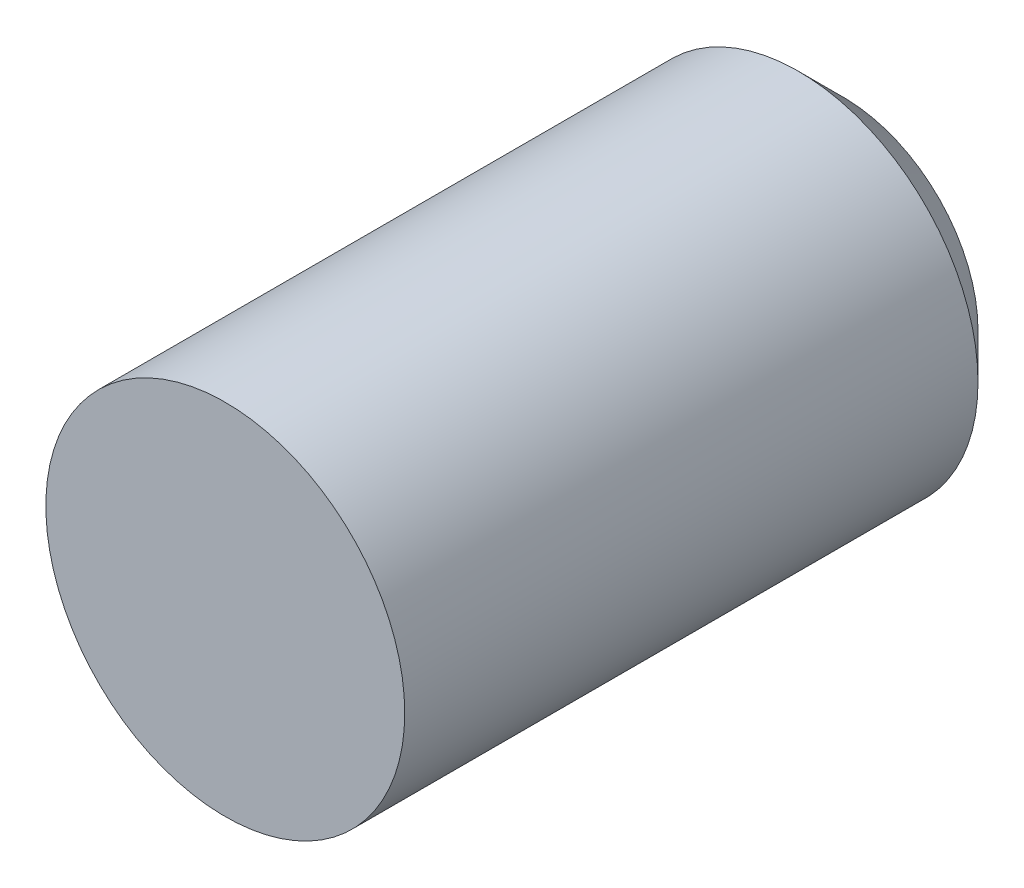
ISO-10303-21;
HEADER;
FILE_DESCRIPTION(('STEP AP214'),'2;1');
FILE_NAME('part.step','',(''),(''),'','','');
FILE_SCHEMA(('AUTOMOTIVE_DESIGN { 1 0 10303 214 1 1 1 1 }'));
ENDSEC;
DATA;
#1=APPLICATION_CONTEXT('core data for automotive mechanical design processes');
#2=APPLICATION_PROTOCOL_DEFINITION('international standard','automotive_design',2000,#1);
#3=PRODUCT_CONTEXT('',#1,'mechanical');
#4=PRODUCT('Part','Part','',(#3));
#5=PRODUCT_RELATED_PRODUCT_CATEGORY('part','',(#4));
#6=PRODUCT_DEFINITION_FORMATION('','',#4);
#7=PRODUCT_DEFINITION_CONTEXT('part definition',#1,'design');
#8=PRODUCT_DEFINITION('design','',#6,#7);
#9=PRODUCT_DEFINITION_SHAPE('','',#8);
#10=(LENGTH_UNIT() NAMED_UNIT(*) SI_UNIT(.MILLI.,.METRE.));
#11=(NAMED_UNIT(*) PLANE_ANGLE_UNIT() SI_UNIT($,.RADIAN.));
#12=(NAMED_UNIT(*) SI_UNIT($,.STERADIAN.) SOLID_ANGLE_UNIT());
#13=UNCERTAINTY_MEASURE_WITH_UNIT(LENGTH_MEASURE(1.E-05),#10,'distance_accuracy_value','');
#14=(GEOMETRIC_REPRESENTATION_CONTEXT(3) GLOBAL_UNCERTAINTY_ASSIGNED_CONTEXT((#13)) GLOBAL_UNIT_ASSIGNED_CONTEXT((#10,
#11,#12)) REPRESENTATION_CONTEXT('',''));
#15=CARTESIAN_POINT('',(0.,0.,0.));
#16=DIRECTION('',(0.,0.,1.));
#17=DIRECTION('',(1.,0.,0.));
#18=AXIS2_PLACEMENT_3D('',#15,#16,#17);
#19=CARTESIAN_POINT('',(0.,0.,0.));
#20=DIRECTION('',(0.,0.,1.));
#21=DIRECTION('',(1.,0.,0.));
#22=AXIS2_PLACEMENT_3D('',#19,#20,#21);
#23=PLANE('',#22);
#24=CARTESIAN_POINT('',(0.,0.,0.));
#25=DIRECTION('',(0.,0.,1.));
#26=DIRECTION('',(1.,0.,0.));
#27=AXIS2_PLACEMENT_3D('',#24,#25,#26);
#28=CIRCLE('',#27,1.0125);
#29=CARTESIAN_POINT('',(1.0125,0.,0.));
#30=VERTEX_POINT('',#29);
#31=EDGE_CURVE('E27',#30,#30,#28,.T.);
#32=ORIENTED_EDGE('',*,*,#31,.F.);
#33=EDGE_LOOP('',(#32));
#34=FACE_BOUND('',#33,.T.);
#35=ADVANCED_FACE('F16',(#34),#23,.F.);
#36=CARTESIAN_POINT('',(0.,0.,4.65));
#37=DIRECTION('',(0.,0.,1.));
#38=DIRECTION('',(1.,0.,0.));
#39=AXIS2_PLACEMENT_3D('',#36,#37,#38);
#40=PLANE('',#39);
#41=CARTESIAN_POINT('',(0.,0.,4.65));
#42=DIRECTION('',(0.,0.,1.));
#43=DIRECTION('',(1.,0.,0.));
#44=AXIS2_PLACEMENT_3D('',#41,#42,#43);
#45=CIRCLE('',#44,1.35);
#46=CARTESIAN_POINT('',(1.35,0.,4.65));
#47=VERTEX_POINT('',#46);
#48=EDGE_CURVE('E20',#47,#47,#45,.T.);
#49=ORIENTED_EDGE('',*,*,#48,.T.);
#50=EDGE_LOOP('',(#49));
#51=FACE_BOUND('',#50,.T.);
#52=ADVANCED_FACE('F76',(#51),#40,.T.);
#53=CARTESIAN_POINT('',(0.,0.,0.3375));
#54=DIRECTION('',(0.,0.,1.));
#55=DIRECTION('',(1.,0.,0.));
#56=AXIS2_PLACEMENT_3D('',#53,#54,#55);
#57=CONICAL_SURFACE('',#56,1.35,0.785398163397);
#58=ORIENTED_EDGE('',*,*,#31,.T.);
#59=DIRECTION('',(-0.707106781186548,0.,-0.707106781186548));
#60=VECTOR('',#59,1.);
#61=CARTESIAN_POINT('',(1.35,0.,0.3375));
#62=LINE('',#61,#60);
#63=CARTESIAN_POINT('',(1.35,0.,0.3375));
#64=VERTEX_POINT('',#63);
#65=EDGE_CURVE('E11',#64,#30,#62,.T.);
#66=ORIENTED_EDGE('',*,*,#65,.F.);
#67=CARTESIAN_POINT('',(0.,0.,0.3375));
#68=DIRECTION('',(0.,0.,1.));
#69=DIRECTION('',(1.,0.,0.));
#70=AXIS2_PLACEMENT_3D('',#67,#68,#69);
#71=CIRCLE('',#70,1.35);
#72=EDGE_CURVE('E44',#64,#64,#71,.T.);
#73=ORIENTED_EDGE('',*,*,#72,.F.);
#74=ORIENTED_EDGE('',*,*,#65,.T.);
#75=EDGE_LOOP('',(#58,#66,#73,#74));
#76=FACE_BOUND('',#75,.T.);
#77=ADVANCED_FACE('F18',(#76),#57,.T.);
#78=CARTESIAN_POINT('',(0.,0.,0.));
#79=DIRECTION('',(0.,0.,1.));
#80=DIRECTION('',(1.,0.,0.));
#81=AXIS2_PLACEMENT_3D('',#78,#79,#80);
#82=CYLINDRICAL_SURFACE('',#81,1.35);
#83=DIRECTION('',(0.,0.,1.));
#84=VECTOR('',#83,1.);
#85=CARTESIAN_POINT('',(1.35,0.,0.));
#86=LINE('',#85,#84);
#87=EDGE_CURVE('E51',#64,#47,#86,.T.);
#88=ORIENTED_EDGE('',*,*,#87,.T.);
#89=ORIENTED_EDGE('',*,*,#48,.F.);
#90=ORIENTED_EDGE('',*,*,#87,.F.);
#91=ORIENTED_EDGE('',*,*,#72,.T.);
#92=EDGE_LOOP('',(#88,#89,#90,#91));
#93=FACE_BOUND('',#92,.T.);
#94=ADVANCED_FACE('F49',(#93),#82,.T.);
#95=CLOSED_SHELL('',(#35,#52,#77,#94));
#96=MANIFOLD_SOLID_BREP('B1',#95);
#97=ADVANCED_BREP_SHAPE_REPRESENTATION('',(#18,#96),#14);
#98=SHAPE_DEFINITION_REPRESENTATION(#9,#97);
ENDSEC;
END-ISO-10303-21;
